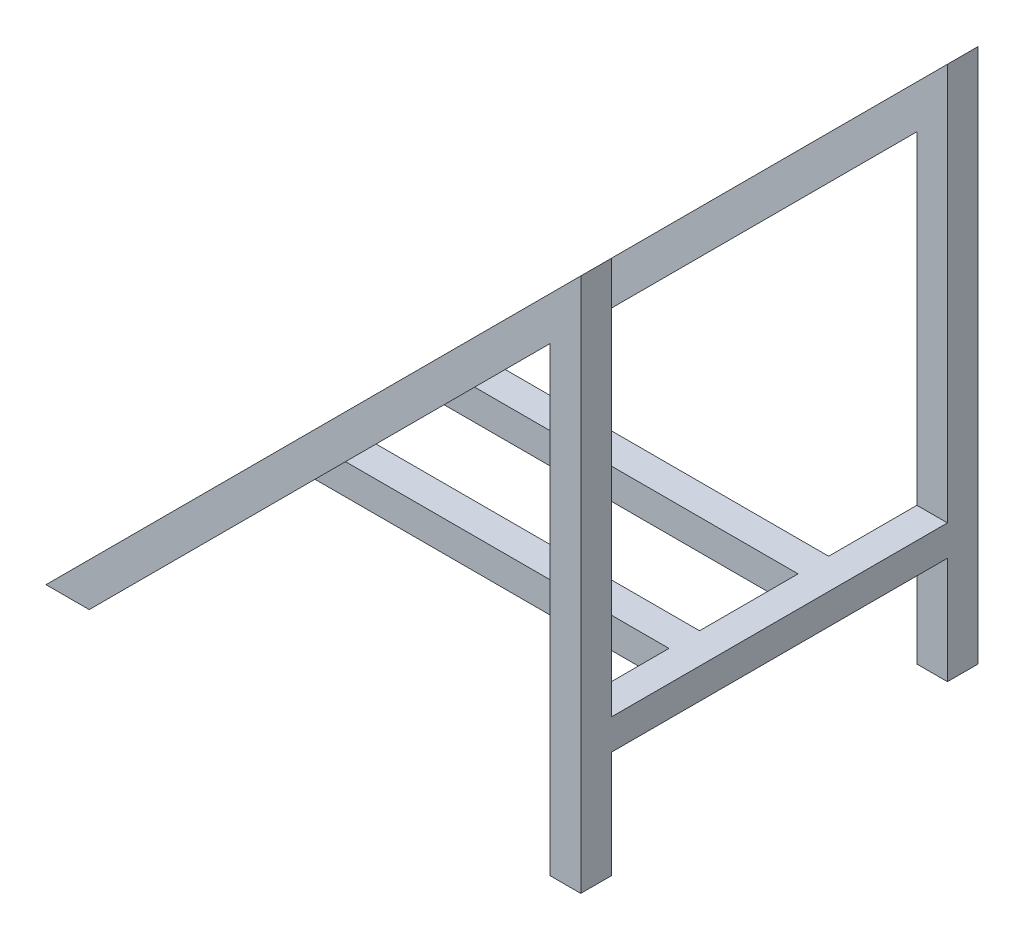
ISO-10303-21;
HEADER;
FILE_DESCRIPTION(('STEP AP214'),'2;1');
FILE_NAME('part.step','',(''),(''),'','','');
FILE_SCHEMA(('AUTOMOTIVE_DESIGN { 1 0 10303 214 1 1 1 1 }'));
ENDSEC;
DATA;
#1=APPLICATION_CONTEXT('core data for automotive mechanical design processes');
#2=APPLICATION_PROTOCOL_DEFINITION('international standard','automotive_design',2000,#1);
#3=PRODUCT_CONTEXT('',#1,'mechanical');
#4=PRODUCT('Part','Part','',(#3));
#5=PRODUCT_RELATED_PRODUCT_CATEGORY('part','',(#4));
#6=PRODUCT_DEFINITION_FORMATION('','',#4);
#7=PRODUCT_DEFINITION_CONTEXT('part definition',#1,'design');
#8=PRODUCT_DEFINITION('design','',#6,#7);
#9=PRODUCT_DEFINITION_SHAPE('','',#8);
#10=(LENGTH_UNIT() NAMED_UNIT(*) SI_UNIT(.MILLI.,.METRE.));
#11=(NAMED_UNIT(*) PLANE_ANGLE_UNIT() SI_UNIT($,.RADIAN.));
#12=(NAMED_UNIT(*) SI_UNIT($,.STERADIAN.) SOLID_ANGLE_UNIT());
#13=UNCERTAINTY_MEASURE_WITH_UNIT(LENGTH_MEASURE(1.E-05),#10,'distance_accuracy_value','');
#14=(GEOMETRIC_REPRESENTATION_CONTEXT(3) GLOBAL_UNCERTAINTY_ASSIGNED_CONTEXT((#13)) GLOBAL_UNIT_ASSIGNED_CONTEXT((#10,
#11,#12)) REPRESENTATION_CONTEXT('',''));
#15=CARTESIAN_POINT('',(0.,0.,0.));
#16=DIRECTION('',(0.,0.,1.));
#17=DIRECTION('',(1.,0.,0.));
#18=AXIS2_PLACEMENT_3D('',#15,#16,#17);
#19=CARTESIAN_POINT('',(28.2842712474618,0.,20.));
#20=DIRECTION('',(-0.707106781186549,0.707106781186546,0.));
#21=DIRECTION('',(-0.707106781186546,-0.707106781186549,0.));
#22=AXIS2_PLACEMENT_3D('',#19,#20,#21);
#23=PLANE('',#22);
#24=DIRECTION('',(-0.707106781186546,-0.707106781186549,0.));
#25=VECTOR('',#24,1.);
#26=CARTESIAN_POINT('',(98.2842712474616,70.,77.75));
#27=LINE('',#26,#25);
#28=CARTESIAN_POINT('',(112.426406871193,84.142135623731,77.75));
#29=VERTEX_POINT('',#28);
#30=CARTESIAN_POINT('',(98.2842712474616,70.,77.75));
#31=VERTEX_POINT('',#30);
#32=EDGE_CURVE('E253',#29,#31,#27,.T.);
#33=ORIENTED_EDGE('',*,*,#32,.T.);
#34=DIRECTION('',(0.,0.,-1.));
#35=VECTOR('',#34,1.);
#36=CARTESIAN_POINT('',(98.2842712474619,70.,240.));
#37=LINE('',#36,#35);
#38=CARTESIAN_POINT('',(98.2842712474619,70.,20.));
#39=VERTEX_POINT('',#38);
#40=EDGE_CURVE('E377',#31,#39,#37,.T.);
#41=ORIENTED_EDGE('',*,*,#40,.T.);
#42=DIRECTION('',(0.707106781186546,0.707106781186549,0.));
#43=VECTOR('',#42,1.);
#44=CARTESIAN_POINT('',(28.2842712474618,0.,20.));
#45=LINE('',#44,#43);
#46=CARTESIAN_POINT('',(28.2842712474618,0.,20.));
#47=VERTEX_POINT('',#46);
#48=EDGE_CURVE('E407',#47,#39,#45,.T.);
#49=ORIENTED_EDGE('',*,*,#48,.F.);
#50=DIRECTION('',(0.,0.,-1.));
#51=VECTOR('',#50,1.);
#52=CARTESIAN_POINT('',(28.2842712474618,0.,20.));
#53=LINE('',#52,#51);
#54=CARTESIAN_POINT('',(28.2842712474618,0.,0.));
#55=VERTEX_POINT('',#54);
#56=EDGE_CURVE('E11',#47,#55,#53,.T.);
#57=ORIENTED_EDGE('',*,*,#56,.T.);
#58=DIRECTION('',(0.707106781186546,0.707106781186549,0.));
#59=VECTOR('',#58,1.);
#60=CARTESIAN_POINT('',(28.2842712474618,0.,0.));
#61=LINE('',#60,#59);
#62=CARTESIAN_POINT('',(329.999999999999,301.715728752538,0.));
#63=VERTEX_POINT('',#62);
#64=EDGE_CURVE('E427',#55,#63,#61,.T.);
#65=ORIENTED_EDGE('',*,*,#64,.T.);
#66=DIRECTION('',(0.,0.,-1.));
#67=VECTOR('',#66,1.);
#68=CARTESIAN_POINT('',(329.999999999999,301.715728752538,20.));
#69=LINE('',#68,#67);
#70=CARTESIAN_POINT('',(329.999999999999,301.715728752538,20.));
#71=VERTEX_POINT('',#70);
#72=EDGE_CURVE('E40',#71,#63,#69,.T.);
#73=ORIENTED_EDGE('',*,*,#72,.F.);
#74=CARTESIAN_POINT('',(112.426406871193,84.142135623731,20.));
#75=VERTEX_POINT('',#74);
#76=EDGE_CURVE('E405',#75,#71,#45,.T.);
#77=ORIENTED_EDGE('',*,*,#76,.F.);
#78=DIRECTION('',(0.,0.,-1.));
#79=VECTOR('',#78,1.);
#80=CARTESIAN_POINT('',(112.426406871193,84.142135623731,240.));
#81=LINE('',#80,#79);
#82=EDGE_CURVE('E373',#29,#75,#81,.T.);
#83=ORIENTED_EDGE('',*,*,#82,.F.);
#84=EDGE_LOOP('',(#33,#41,#49,#57,#65,#73,#77,#83));
#85=FACE_BOUND('',#84,.T.);
#86=ADVANCED_FACE('F32',(#85),#23,.F.);
#87=CARTESIAN_POINT('',(329.999999999999,301.715728752538,20.));
#88=DIRECTION('',(1.,0.,0.));
#89=DIRECTION('',(0.,1.,0.));
#90=AXIS2_PLACEMENT_3D('',#87,#88,#89);
#91=PLANE('',#90);
#92=DIRECTION('',(0.,1.,0.));
#93=VECTOR('',#92,1.);
#94=CARTESIAN_POINT('',(329.999999999999,70.,77.75));
#95=LINE('',#94,#93);
#96=CARTESIAN_POINT('',(329.999999999999,70.,77.75));
#97=VERTEX_POINT('',#96);
#98=CARTESIAN_POINT('',(329.999999999999,90.,77.75));
#99=VERTEX_POINT('',#98);
#100=EDGE_CURVE('E242',#97,#99,#95,.T.);
#101=ORIENTED_EDGE('',*,*,#100,.T.);
#102=DIRECTION('',(0.,0.,-1.));
#103=VECTOR('',#102,1.);
#104=CARTESIAN_POINT('',(329.999999999999,90.,240.));
#105=LINE('',#104,#103);
#106=CARTESIAN_POINT('',(329.999999999999,90.,20.));
#107=VERTEX_POINT('',#106);
#108=EDGE_CURVE('E230',#99,#107,#105,.T.);
#109=ORIENTED_EDGE('',*,*,#108,.T.);
#110=DIRECTION('',(0.,-1.,0.));
#111=VECTOR('',#110,1.);
#112=CARTESIAN_POINT('',(329.999999999999,301.715728752538,20.));
#113=LINE('',#112,#111);
#114=EDGE_CURVE('E411',#71,#107,#113,.T.);
#115=ORIENTED_EDGE('',*,*,#114,.F.);
#116=ORIENTED_EDGE('',*,*,#72,.T.);
#117=DIRECTION('',(0.,-1.,0.));
#118=VECTOR('',#117,1.);
#119=CARTESIAN_POINT('',(329.999999999999,301.715728752538,0.));
#120=LINE('',#119,#118);
#121=CARTESIAN_POINT('',(329.999999999999,0.,0.));
#122=VERTEX_POINT('',#121);
#123=EDGE_CURVE('E429',#63,#122,#120,.T.);
#124=ORIENTED_EDGE('',*,*,#123,.T.);
#125=DIRECTION('',(0.,0.,-1.));
#126=VECTOR('',#125,1.);
#127=CARTESIAN_POINT('',(329.999999999999,0.,20.));
#128=LINE('',#127,#126);
#129=CARTESIAN_POINT('',(329.999999999999,0.,20.));
#130=VERTEX_POINT('',#129);
#131=EDGE_CURVE('E444',#130,#122,#128,.T.);
#132=ORIENTED_EDGE('',*,*,#131,.F.);
#133=CARTESIAN_POINT('',(329.999999999999,70.0000000000001,20.));
#134=VERTEX_POINT('',#133);
#135=EDGE_CURVE('E410',#134,#130,#113,.T.);
#136=ORIENTED_EDGE('',*,*,#135,.F.);
#137=DIRECTION('',(0.,0.,-1.));
#138=VECTOR('',#137,1.);
#139=CARTESIAN_POINT('',(329.999999999999,70.,240.));
#140=LINE('',#139,#138);
#141=EDGE_CURVE('E47',#97,#134,#140,.T.);
#142=ORIENTED_EDGE('',*,*,#141,.F.);
#143=EDGE_LOOP('',(#101,#109,#115,#116,#124,#132,#136,#142));
#144=FACE_BOUND('',#143,.T.);
#145=ADVANCED_FACE('F243',(#144),#91,.F.);
#146=CARTESIAN_POINT('',(98.2842712474616,70.,162.25));
#147=VERTEX_POINT('',#146);
#148=CARTESIAN_POINT('',(98.2842712474616,70.,97.75));
#149=VERTEX_POINT('',#148);
#150=EDGE_CURVE('E383',#147,#149,#37,.T.);
#151=ORIENTED_EDGE('',*,*,#150,.T.);
#152=DIRECTION('',(-0.707106781186546,-0.707106781186549,0.));
#153=VECTOR('',#152,1.);
#154=CARTESIAN_POINT('',(98.2842712474616,70.,97.75));
#155=LINE('',#154,#153);
#156=CARTESIAN_POINT('',(112.426406871193,84.1421356237311,97.75));
#157=VERTEX_POINT('',#156);
#158=EDGE_CURVE('E265',#157,#149,#155,.T.);
#159=ORIENTED_EDGE('',*,*,#158,.F.);
#160=CARTESIAN_POINT('',(112.426406871193,84.142135623731,162.25));
#161=VERTEX_POINT('',#160);
#162=EDGE_CURVE('E516',#161,#157,#81,.T.);
#163=ORIENTED_EDGE('',*,*,#162,.F.);
#164=DIRECTION('',(-0.707106781186546,-0.707106781186549,0.));
#165=VECTOR('',#164,1.);
#166=CARTESIAN_POINT('',(98.2842712474616,70.,162.25));
#167=LINE('',#166,#165);
#168=EDGE_CURVE('E283',#161,#147,#167,.T.);
#169=ORIENTED_EDGE('',*,*,#168,.T.);
#170=EDGE_LOOP('',(#151,#159,#163,#169));
#171=FACE_BOUND('',#170,.T.);
#172=ADVANCED_FACE('F512',(#171),#23,.F.);
#173=CARTESIAN_POINT('',(329.999999999999,90.,162.25));
#174=VERTEX_POINT('',#173);
#175=CARTESIAN_POINT('',(329.999999999999,90.,97.75));
#176=VERTEX_POINT('',#175);
#177=EDGE_CURVE('E238',#174,#176,#105,.T.);
#178=ORIENTED_EDGE('',*,*,#177,.T.);
#179=DIRECTION('',(0.,1.,0.));
#180=VECTOR('',#179,1.);
#181=CARTESIAN_POINT('',(329.999999999999,70.,97.75));
#182=LINE('',#181,#180);
#183=CARTESIAN_POINT('',(329.999999999999,70.,97.75));
#184=VERTEX_POINT('',#183);
#185=EDGE_CURVE('E55',#184,#176,#182,.T.);
#186=ORIENTED_EDGE('',*,*,#185,.F.);
#187=CARTESIAN_POINT('',(329.999999999999,70.,162.25));
#188=VERTEX_POINT('',#187);
#189=EDGE_CURVE('E401',#188,#184,#140,.T.);
#190=ORIENTED_EDGE('',*,*,#189,.F.);
#191=DIRECTION('',(0.,1.,0.));
#192=VECTOR('',#191,1.);
#193=CARTESIAN_POINT('',(329.999999999999,70.,162.25));
#194=LINE('',#193,#192);
#195=EDGE_CURVE('E276',#188,#174,#194,.T.);
#196=ORIENTED_EDGE('',*,*,#195,.T.);
#197=EDGE_LOOP('',(#178,#186,#190,#196));
#198=FACE_BOUND('',#197,.T.);
#199=ADVANCED_FACE('F562',(#198),#91,.F.);
#200=CARTESIAN_POINT('',(0.,0.,20.));
#201=DIRECTION('',(0.,0.,-1.));
#202=DIRECTION('',(-1.,0.,0.));
#203=AXIS2_PLACEMENT_3D('',#200,#201,#202);
#204=PLANE('',#203);
#205=DIRECTION('',(0.707106781186548,-0.707106781186547,0.));
#206=VECTOR('',#205,1.);
#207=CARTESIAN_POINT('',(98.2842712474619,70.,20.));
#208=LINE('',#207,#206);
#209=CARTESIAN_POINT('',(84.1421356237309,84.1421356237309,20.));
#210=VERTEX_POINT('',#209);
#211=EDGE_CURVE('E357',#210,#39,#208,.T.);
#212=ORIENTED_EDGE('',*,*,#211,.F.);
#213=DIRECTION('',(0.707106781186546,0.707106781186549,0.));
#214=VECTOR('',#213,1.);
#215=CARTESIAN_POINT('',(0.,0.,20.));
#216=LINE('',#215,#214);
#217=CARTESIAN_POINT('',(0.,0.,20.));
#218=VERTEX_POINT('',#217);
#219=EDGE_CURVE('E421',#218,#210,#216,.T.);
#220=ORIENTED_EDGE('',*,*,#219,.F.);
#221=DIRECTION('',(1.,0.,0.));
#222=VECTOR('',#221,1.);
#223=CARTESIAN_POINT('',(0.,0.,20.));
#224=LINE('',#223,#222);
#225=EDGE_CURVE('E402',#218,#47,#224,.T.);
#226=ORIENTED_EDGE('',*,*,#225,.T.);
#227=ORIENTED_EDGE('',*,*,#48,.T.);
#228=EDGE_LOOP('',(#212,#220,#226,#227));
#229=FACE_BOUND('',#228,.T.);
#230=ADVANCED_FACE('F502',(#229),#204,.F.);
#231=DIRECTION('',(-0.707106781186547,0.707106781186547,0.));
#232=VECTOR('',#231,1.);
#233=CARTESIAN_POINT('',(112.426406871193,84.142135623731,20.));
#234=LINE('',#233,#232);
#235=CARTESIAN_POINT('',(98.2842712474615,98.2842712474619,20.));
#236=VERTEX_POINT('',#235);
#237=EDGE_CURVE('E362',#75,#236,#234,.T.);
#238=ORIENTED_EDGE('',*,*,#237,.F.);
#239=ORIENTED_EDGE('',*,*,#76,.T.);
#240=ORIENTED_EDGE('',*,*,#114,.T.);
#241=DIRECTION('',(-1.,0.,0.));
#242=VECTOR('',#241,1.);
#243=CARTESIAN_POINT('',(329.999999999999,90.,20.));
#244=LINE('',#243,#242);
#245=CARTESIAN_POINT('',(349.999999999999,90.,20.));
#246=VERTEX_POINT('',#245);
#247=EDGE_CURVE('E235',#246,#107,#244,.T.);
#248=ORIENTED_EDGE('',*,*,#247,.F.);
#249=DIRECTION('',(0.,-1.,0.));
#250=VECTOR('',#249,1.);
#251=CARTESIAN_POINT('',(349.999999999999,350.,20.));
#252=LINE('',#251,#250);
#253=CARTESIAN_POINT('',(349.999999999999,350.,20.));
#254=VERTEX_POINT('',#253);
#255=EDGE_CURVE('E417',#254,#246,#252,.T.);
#256=ORIENTED_EDGE('',*,*,#255,.F.);
#257=EDGE_CURVE('E420',#236,#254,#216,.T.);
#258=ORIENTED_EDGE('',*,*,#257,.F.);
#259=EDGE_LOOP('',(#238,#239,#240,#248,#256,#258));
#260=FACE_BOUND('',#259,.T.);
#261=ADVANCED_FACE('F537',(#260),#204,.F.);
#262=DIRECTION('',(1.,0.,0.));
#263=VECTOR('',#262,1.);
#264=CARTESIAN_POINT('',(329.999999999999,70.,20.));
#265=LINE('',#264,#263);
#266=CARTESIAN_POINT('',(349.999999999999,70.,20.));
#267=VERTEX_POINT('',#266);
#268=EDGE_CURVE('E382',#134,#267,#265,.T.);
#269=ORIENTED_EDGE('',*,*,#268,.F.);
#270=ORIENTED_EDGE('',*,*,#135,.T.);
#271=DIRECTION('',(1.,0.,0.));
#272=VECTOR('',#271,1.);
#273=CARTESIAN_POINT('',(329.999999999999,0.,20.));
#274=LINE('',#273,#272);
#275=CARTESIAN_POINT('',(349.999999999999,0.,20.));
#276=VERTEX_POINT('',#275);
#277=EDGE_CURVE('E413',#130,#276,#274,.T.);
#278=ORIENTED_EDGE('',*,*,#277,.T.);
#279=EDGE_CURVE('E416',#267,#276,#252,.T.);
#280=ORIENTED_EDGE('',*,*,#279,.F.);
#281=EDGE_LOOP('',(#269,#270,#278,#280));
#282=FACE_BOUND('',#281,.T.);
#283=ADVANCED_FACE('F463',(#282),#204,.F.);
#284=CARTESIAN_POINT('',(0.,0.,20.));
#285=DIRECTION('',(0.,1.,0.));
#286=DIRECTION('',(0.,0.,1.));
#287=AXIS2_PLACEMENT_3D('',#284,#285,#286);
#288=PLANE('',#287);
#289=DIRECTION('',(1.,0.,0.));
#290=VECTOR('',#289,1.);
#291=CARTESIAN_POINT('',(0.,0.,0.));
#292=LINE('',#291,#290);
#293=CARTESIAN_POINT('',(0.,0.,0.));
#294=VERTEX_POINT('',#293);
#295=EDGE_CURVE('E400',#294,#55,#292,.T.);
#296=ORIENTED_EDGE('',*,*,#295,.T.);
#297=ORIENTED_EDGE('',*,*,#56,.F.);
#298=ORIENTED_EDGE('',*,*,#225,.F.);
#299=DIRECTION('',(0.,0.,-1.));
#300=VECTOR('',#299,1.);
#301=CARTESIAN_POINT('',(0.,0.,20.));
#302=LINE('',#301,#300);
#303=EDGE_CURVE('E424',#218,#294,#302,.T.);
#304=ORIENTED_EDGE('',*,*,#303,.T.);
#305=EDGE_LOOP('',(#296,#297,#298,#304));
#306=FACE_BOUND('',#305,.T.);
#307=ADVANCED_FACE('F34',(#306),#288,.F.);
#308=CARTESIAN_POINT('',(98.2842712474619,70.,240.));
#309=VERTEX_POINT('',#308);
#310=CARTESIAN_POINT('',(98.2842712474616,70.,182.25));
#311=VERTEX_POINT('',#310);
#312=EDGE_CURVE('E379',#309,#311,#37,.T.);
#313=ORIENTED_EDGE('',*,*,#312,.T.);
#314=DIRECTION('',(-0.707106781186546,-0.707106781186549,0.));
#315=VECTOR('',#314,1.);
#316=CARTESIAN_POINT('',(98.2842712474616,70.,182.25));
#317=LINE('',#316,#315);
#318=CARTESIAN_POINT('',(112.426406871193,84.1421356237311,182.25));
#319=VERTEX_POINT('',#318);
#320=EDGE_CURVE('E295',#319,#311,#317,.T.);
#321=ORIENTED_EDGE('',*,*,#320,.F.);
#322=CARTESIAN_POINT('',(112.426406871193,84.142135623731,240.));
#323=VERTEX_POINT('',#322);
#324=EDGE_CURVE('E374',#323,#319,#81,.T.);
#325=ORIENTED_EDGE('',*,*,#324,.F.);
#326=DIRECTION('',(0.707106781186546,0.707106781186549,0.));
#327=VECTOR('',#326,1.);
#328=CARTESIAN_POINT('',(28.2842712474618,0.,240.));
#329=LINE('',#328,#327);
#330=CARTESIAN_POINT('',(329.999999999999,301.715728752538,240.));
#331=VERTEX_POINT('',#330);
#332=EDGE_CURVE('E325',#323,#331,#329,.T.);
#333=ORIENTED_EDGE('',*,*,#332,.T.);
#334=DIRECTION('',(0.,0.,1.));
#335=VECTOR('',#334,1.);
#336=CARTESIAN_POINT('',(329.999999999999,301.715728752538,240.));
#337=LINE('',#336,#335);
#338=CARTESIAN_POINT('',(329.999999999999,301.715728752538,260.));
#339=VERTEX_POINT('',#338);
#340=EDGE_CURVE('E346',#331,#339,#337,.T.);
#341=ORIENTED_EDGE('',*,*,#340,.T.);
#342=DIRECTION('',(0.707106781186546,0.707106781186549,0.));
#343=VECTOR('',#342,1.);
#344=CARTESIAN_POINT('',(28.2842712474618,0.,260.));
#345=LINE('',#344,#343);
#346=CARTESIAN_POINT('',(28.2842712474618,0.,260.));
#347=VERTEX_POINT('',#346);
#348=EDGE_CURVE('E310',#347,#339,#345,.T.);
#349=ORIENTED_EDGE('',*,*,#348,.F.);
#350=DIRECTION('',(0.,0.,1.));
#351=VECTOR('',#350,1.);
#352=CARTESIAN_POINT('',(28.2842712474618,0.,240.));
#353=LINE('',#352,#351);
#354=CARTESIAN_POINT('',(28.2842712474618,0.,240.));
#355=VERTEX_POINT('',#354);
#356=EDGE_CURVE('E329',#355,#347,#353,.T.);
#357=ORIENTED_EDGE('',*,*,#356,.F.);
#358=EDGE_CURVE('E326',#355,#309,#329,.T.);
#359=ORIENTED_EDGE('',*,*,#358,.T.);
#360=EDGE_LOOP('',(#313,#321,#325,#333,#341,#349,#357,#359));
#361=FACE_BOUND('',#360,.T.);
#362=ADVANCED_FACE('F490',(#361),#23,.F.);
#363=CARTESIAN_POINT('',(329.999999999999,90.,240.));
#364=VERTEX_POINT('',#363);
#365=CARTESIAN_POINT('',(329.999999999999,90.,182.25));
#366=VERTEX_POINT('',#365);
#367=EDGE_CURVE('E241',#364,#366,#105,.T.);
#368=ORIENTED_EDGE('',*,*,#367,.T.);
#369=DIRECTION('',(0.,1.,0.));
#370=VECTOR('',#369,1.);
#371=CARTESIAN_POINT('',(329.999999999999,70.,182.25));
#372=LINE('',#371,#370);
#373=CARTESIAN_POINT('',(329.999999999999,70.,182.25));
#374=VERTEX_POINT('',#373);
#375=EDGE_CURVE('E274',#374,#366,#372,.T.);
#376=ORIENTED_EDGE('',*,*,#375,.F.);
#377=CARTESIAN_POINT('',(329.999999999999,70.,240.));
#378=VERTEX_POINT('',#377);
#379=EDGE_CURVE('E397',#378,#374,#140,.T.);
#380=ORIENTED_EDGE('',*,*,#379,.F.);
#381=DIRECTION('',(0.,-1.,0.));
#382=VECTOR('',#381,1.);
#383=CARTESIAN_POINT('',(329.999999999999,301.715728752538,240.));
#384=LINE('',#383,#382);
#385=CARTESIAN_POINT('',(329.999999999999,0.,240.));
#386=VERTEX_POINT('',#385);
#387=EDGE_CURVE('E321',#378,#386,#384,.T.);
#388=ORIENTED_EDGE('',*,*,#387,.T.);
#389=DIRECTION('',(0.,0.,1.));
#390=VECTOR('',#389,1.);
#391=CARTESIAN_POINT('',(329.999999999999,0.,240.));
#392=LINE('',#391,#390);
#393=CARTESIAN_POINT('',(329.999999999999,0.,260.));
#394=VERTEX_POINT('',#393);
#395=EDGE_CURVE('E348',#386,#394,#392,.T.);
#396=ORIENTED_EDGE('',*,*,#395,.T.);
#397=DIRECTION('',(0.,-1.,0.));
#398=VECTOR('',#397,1.);
#399=CARTESIAN_POINT('',(329.999999999999,301.715728752538,260.));
#400=LINE('',#399,#398);
#401=EDGE_CURVE('E340',#339,#394,#400,.T.);
#402=ORIENTED_EDGE('',*,*,#401,.F.);
#403=ORIENTED_EDGE('',*,*,#340,.F.);
#404=EDGE_CURVE('E322',#331,#364,#384,.T.);
#405=ORIENTED_EDGE('',*,*,#404,.T.);
#406=EDGE_LOOP('',(#368,#376,#380,#388,#396,#402,#403,#405));
#407=FACE_BOUND('',#406,.T.);
#408=ADVANCED_FACE('F477',(#407),#91,.F.);
#409=CARTESIAN_POINT('',(329.999999999999,0.,20.));
#410=DIRECTION('',(0.,1.,0.));
#411=DIRECTION('',(0.,0.,1.));
#412=AXIS2_PLACEMENT_3D('',#409,#410,#411);
#413=PLANE('',#412);
#414=DIRECTION('',(1.,0.,0.));
#415=VECTOR('',#414,1.);
#416=CARTESIAN_POINT('',(329.999999999999,0.,0.));
#417=LINE('',#416,#415);
#418=CARTESIAN_POINT('',(349.999999999999,0.,0.));
#419=VERTEX_POINT('',#418);
#420=EDGE_CURVE('E431',#122,#419,#417,.T.);
#421=ORIENTED_EDGE('',*,*,#420,.T.);
#422=DIRECTION('',(0.,0.,-1.));
#423=VECTOR('',#422,1.);
#424=CARTESIAN_POINT('',(349.999999999999,0.,20.));
#425=LINE('',#424,#423);
#426=EDGE_CURVE('E442',#276,#419,#425,.T.);
#427=ORIENTED_EDGE('',*,*,#426,.F.);
#428=ORIENTED_EDGE('',*,*,#277,.F.);
#429=ORIENTED_EDGE('',*,*,#131,.T.);
#430=EDGE_LOOP('',(#421,#427,#428,#429));
#431=FACE_BOUND('',#430,.T.);
#432=ADVANCED_FACE('F459',(#431),#413,.F.);
#433=CARTESIAN_POINT('',(349.999999999999,350.,20.));
#434=DIRECTION('',(1.,0.,0.));
#435=DIRECTION('',(0.,1.,0.));
#436=AXIS2_PLACEMENT_3D('',#433,#434,#435);
#437=PLANE('',#436);
#438=DIRECTION('',(0.,-1.,0.));
#439=VECTOR('',#438,1.);
#440=CARTESIAN_POINT('',(349.999999999999,350.,0.));
#441=LINE('',#440,#439);
#442=CARTESIAN_POINT('',(349.999999999999,350.,0.));
#443=VERTEX_POINT('',#442);
#444=EDGE_CURVE('E434',#443,#419,#441,.T.);
#445=ORIENTED_EDGE('',*,*,#444,.F.);
#446=DIRECTION('',(0.,0.,-1.));
#447=VECTOR('',#446,1.);
#448=CARTESIAN_POINT('',(349.999999999999,350.,20.));
#449=LINE('',#448,#447);
#450=EDGE_CURVE('E440',#254,#443,#449,.T.);
#451=ORIENTED_EDGE('',*,*,#450,.F.);
#452=ORIENTED_EDGE('',*,*,#255,.T.);
#453=DIRECTION('',(0.,0.,-1.));
#454=VECTOR('',#453,1.);
#455=CARTESIAN_POINT('',(349.999999999999,90.,240.));
#456=LINE('',#455,#454);
#457=CARTESIAN_POINT('',(349.999999999999,90.,240.));
#458=VERTEX_POINT('',#457);
#459=EDGE_CURVE('E392',#458,#246,#456,.T.);
#460=ORIENTED_EDGE('',*,*,#459,.F.);
#461=DIRECTION('',(0.,-1.,0.));
#462=VECTOR('',#461,1.);
#463=CARTESIAN_POINT('',(349.999999999999,350.,240.));
#464=LINE('',#463,#462);
#465=CARTESIAN_POINT('',(349.999999999999,350.,240.));
#466=VERTEX_POINT('',#465);
#467=EDGE_CURVE('E315',#466,#458,#464,.T.);
#468=ORIENTED_EDGE('',*,*,#467,.F.);
#469=DIRECTION('',(0.,0.,1.));
#470=VECTOR('',#469,1.);
#471=CARTESIAN_POINT('',(349.999999999999,350.,240.));
#472=LINE('',#471,#470);
#473=CARTESIAN_POINT('',(349.999999999999,350.,260.));
#474=VERTEX_POINT('',#473);
#475=EDGE_CURVE('E352',#466,#474,#472,.T.);
#476=ORIENTED_EDGE('',*,*,#475,.T.);
#477=DIRECTION('',(0.,-1.,0.));
#478=VECTOR('',#477,1.);
#479=CARTESIAN_POINT('',(349.999999999999,350.,260.));
#480=LINE('',#479,#478);
#481=CARTESIAN_POINT('',(349.999999999999,0.,260.));
#482=VERTEX_POINT('',#481);
#483=EDGE_CURVE('E334',#474,#482,#480,.T.);
#484=ORIENTED_EDGE('',*,*,#483,.T.);
#485=DIRECTION('',(0.,0.,1.));
#486=VECTOR('',#485,1.);
#487=CARTESIAN_POINT('',(349.999999999999,0.,240.));
#488=LINE('',#487,#486);
#489=CARTESIAN_POINT('',(349.999999999999,0.,240.));
#490=VERTEX_POINT('',#489);
#491=EDGE_CURVE('E350',#490,#482,#488,.T.);
#492=ORIENTED_EDGE('',*,*,#491,.F.);
#493=CARTESIAN_POINT('',(349.999999999999,70.,240.));
#494=VERTEX_POINT('',#493);
#495=EDGE_CURVE('E314',#494,#490,#464,.T.);
#496=ORIENTED_EDGE('',*,*,#495,.F.);
#497=DIRECTION('',(0.,0.,-1.));
#498=VECTOR('',#497,1.);
#499=CARTESIAN_POINT('',(349.999999999999,70.,240.));
#500=LINE('',#499,#498);
#501=EDGE_CURVE('E394',#494,#267,#500,.T.);
#502=ORIENTED_EDGE('',*,*,#501,.T.);
#503=ORIENTED_EDGE('',*,*,#279,.T.);
#504=ORIENTED_EDGE('',*,*,#426,.T.);
#505=EDGE_LOOP('',(#445,#451,#452,#460,#468,#476,#484,#492,#496,#502,#503,#504));
#506=FACE_BOUND('',#505,.T.);
#507=ADVANCED_FACE('F468',(#506),#437,.T.);
#508=CARTESIAN_POINT('',(0.,0.,20.));
#509=DIRECTION('',(-0.707106781186549,0.707106781186546,0.));
#510=DIRECTION('',(-0.707106781186546,-0.707106781186549,0.));
#511=AXIS2_PLACEMENT_3D('',#508,#509,#510);
#512=PLANE('',#511);
#513=DIRECTION('',(0.707106781186546,0.707106781186549,0.));
#514=VECTOR('',#513,1.);
#515=CARTESIAN_POINT('',(0.,0.,0.));
#516=LINE('',#515,#514);
#517=EDGE_CURVE('E406',#294,#443,#516,.T.);
#518=ORIENTED_EDGE('',*,*,#517,.F.);
#519=ORIENTED_EDGE('',*,*,#303,.F.);
#520=ORIENTED_EDGE('',*,*,#219,.T.);
#521=DIRECTION('',(0.,0.,-1.));
#522=VECTOR('',#521,1.);
#523=CARTESIAN_POINT('',(84.1421356237309,84.1421356237309,240.));
#524=LINE('',#523,#522);
#525=CARTESIAN_POINT('',(84.1421356237309,84.1421356237309,240.));
#526=VERTEX_POINT('',#525);
#527=EDGE_CURVE('E365',#526,#210,#524,.T.);
#528=ORIENTED_EDGE('',*,*,#527,.F.);
#529=DIRECTION('',(0.707106781186546,0.707106781186549,0.));
#530=VECTOR('',#529,1.);
#531=CARTESIAN_POINT('',(0.,0.,240.));
#532=LINE('',#531,#530);
#533=CARTESIAN_POINT('',(0.,0.,240.));
#534=VERTEX_POINT('',#533);
#535=EDGE_CURVE('E311',#534,#526,#532,.T.);
#536=ORIENTED_EDGE('',*,*,#535,.F.);
#537=DIRECTION('',(0.,0.,1.));
#538=VECTOR('',#537,1.);
#539=CARTESIAN_POINT('',(0.,0.,240.));
#540=LINE('',#539,#538);
#541=CARTESIAN_POINT('',(0.,0.,260.));
#542=VERTEX_POINT('',#541);
#543=EDGE_CURVE('E355',#534,#542,#540,.T.);
#544=ORIENTED_EDGE('',*,*,#543,.T.);
#545=DIRECTION('',(0.707106781186546,0.707106781186549,0.));
#546=VECTOR('',#545,1.);
#547=CARTESIAN_POINT('',(0.,0.,260.));
#548=LINE('',#547,#546);
#549=EDGE_CURVE('E332',#542,#474,#548,.T.);
#550=ORIENTED_EDGE('',*,*,#549,.T.);
#551=ORIENTED_EDGE('',*,*,#475,.F.);
#552=CARTESIAN_POINT('',(98.2842712474617,98.2842712474621,240.));
#553=VERTEX_POINT('',#552);
#554=EDGE_CURVE('E309',#553,#466,#532,.T.);
#555=ORIENTED_EDGE('',*,*,#554,.F.);
#556=DIRECTION('',(0.,0.,-1.));
#557=VECTOR('',#556,1.);
#558=CARTESIAN_POINT('',(98.2842712474619,98.2842712474619,240.));
#559=LINE('',#558,#557);
#560=EDGE_CURVE('E371',#553,#236,#559,.T.);
#561=ORIENTED_EDGE('',*,*,#560,.T.);
#562=ORIENTED_EDGE('',*,*,#257,.T.);
#563=ORIENTED_EDGE('',*,*,#450,.T.);
#564=EDGE_LOOP('',(#518,#519,#520,#528,#536,#544,#550,#551,#555,#561,#562,#563));
#565=FACE_BOUND('',#564,.T.);
#566=ADVANCED_FACE('F504',(#565),#512,.T.);
#567=CARTESIAN_POINT('',(0.,0.,0.));
#568=DIRECTION('',(0.,0.,-1.));
#569=DIRECTION('',(-1.,0.,0.));
#570=AXIS2_PLACEMENT_3D('',#567,#568,#569);
#571=PLANE('',#570);
#572=ORIENTED_EDGE('',*,*,#295,.F.);
#573=ORIENTED_EDGE('',*,*,#517,.T.);
#574=ORIENTED_EDGE('',*,*,#444,.T.);
#575=ORIENTED_EDGE('',*,*,#420,.F.);
#576=ORIENTED_EDGE('',*,*,#123,.F.);
#577=ORIENTED_EDGE('',*,*,#64,.F.);
#578=EDGE_LOOP('',(#572,#573,#574,#575,#576,#577));
#579=FACE_BOUND('',#578,.T.);
#580=ADVANCED_FACE('F455',(#579),#571,.T.);
#581=CARTESIAN_POINT('',(329.999999999999,70.,240.));
#582=DIRECTION('',(0.,1.,0.));
#583=DIRECTION('',(0.,0.,1.));
#584=AXIS2_PLACEMENT_3D('',#581,#582,#583);
#585=PLANE('',#584);
#586=ORIENTED_EDGE('',*,*,#268,.T.);
#587=ORIENTED_EDGE('',*,*,#501,.F.);
#588=DIRECTION('',(1.,0.,0.));
#589=VECTOR('',#588,1.);
#590=CARTESIAN_POINT('',(329.999999999999,70.,240.));
#591=LINE('',#590,#589);
#592=EDGE_CURVE('E384',#378,#494,#591,.T.);
#593=ORIENTED_EDGE('',*,*,#592,.F.);
#594=ORIENTED_EDGE('',*,*,#379,.T.);
#595=DIRECTION('',(1.,0.,0.));
#596=VECTOR('',#595,1.);
#597=CARTESIAN_POINT('',(329.999999999999,70.,182.25));
#598=LINE('',#597,#596);
#599=EDGE_CURVE('E280',#311,#374,#598,.T.);
#600=ORIENTED_EDGE('',*,*,#599,.F.);
#601=DIRECTION('',(0.,0.,1.));
#602=VECTOR('',#601,1.);
#603=CARTESIAN_POINT('',(98.2842712474616,70.,162.25));
#604=LINE('',#603,#602);
#605=EDGE_CURVE('E301',#147,#311,#604,.T.);
#606=ORIENTED_EDGE('',*,*,#605,.F.);
#607=DIRECTION('',(1.,0.,0.));
#608=VECTOR('',#607,1.);
#609=CARTESIAN_POINT('',(329.999999999999,70.,162.25));
#610=LINE('',#609,#608);
#611=EDGE_CURVE('E286',#147,#188,#610,.T.);
#612=ORIENTED_EDGE('',*,*,#611,.T.);
#613=ORIENTED_EDGE('',*,*,#189,.T.);
#614=DIRECTION('',(1.,0.,0.));
#615=VECTOR('',#614,1.);
#616=CARTESIAN_POINT('',(329.999999999999,70.,97.75));
#617=LINE('',#616,#615);
#618=EDGE_CURVE('E247',#149,#184,#617,.T.);
#619=ORIENTED_EDGE('',*,*,#618,.F.);
#620=DIRECTION('',(0.,0.,1.));
#621=VECTOR('',#620,1.);
#622=CARTESIAN_POINT('',(98.2842712474616,70.,77.75));
#623=LINE('',#622,#621);
#624=EDGE_CURVE('E271',#31,#149,#623,.T.);
#625=ORIENTED_EDGE('',*,*,#624,.F.);
#626=DIRECTION('',(1.,0.,0.));
#627=VECTOR('',#626,1.);
#628=CARTESIAN_POINT('',(329.999999999999,70.,77.75));
#629=LINE('',#628,#627);
#630=EDGE_CURVE('E258',#31,#97,#629,.T.);
#631=ORIENTED_EDGE('',*,*,#630,.T.);
#632=ORIENTED_EDGE('',*,*,#141,.T.);
#633=EDGE_LOOP('',(#586,#587,#593,#594,#600,#606,#612,#613,#619,#625,#631,#632));
#634=FACE_BOUND('',#633,.T.);
#635=ADVANCED_FACE('F465',(#634),#585,.F.);
#636=CARTESIAN_POINT('',(329.999999999999,90.,240.));
#637=DIRECTION('',(0.,-1.,0.));
#638=DIRECTION('',(1.,0.,0.));
#639=AXIS2_PLACEMENT_3D('',#636,#637,#638);
#640=PLANE('',#639);
#641=ORIENTED_EDGE('',*,*,#247,.T.);
#642=ORIENTED_EDGE('',*,*,#108,.F.);
#643=DIRECTION('',(-1.,0.,0.));
#644=VECTOR('',#643,1.);
#645=CARTESIAN_POINT('',(329.999999999999,90.,77.75));
#646=LINE('',#645,#644);
#647=CARTESIAN_POINT('',(118.284271247461,90.,77.75));
#648=VERTEX_POINT('',#647);
#649=EDGE_CURVE('E233',#99,#648,#646,.T.);
#650=ORIENTED_EDGE('',*,*,#649,.T.);
#651=DIRECTION('',(0.,0.,1.));
#652=VECTOR('',#651,1.);
#653=CARTESIAN_POINT('',(118.284271247461,90.,77.75));
#654=LINE('',#653,#652);
#655=CARTESIAN_POINT('',(118.284271247461,90.,97.75));
#656=VERTEX_POINT('',#655);
#657=EDGE_CURVE('E260',#648,#656,#654,.T.);
#658=ORIENTED_EDGE('',*,*,#657,.T.);
#659=DIRECTION('',(-1.,0.,0.));
#660=VECTOR('',#659,1.);
#661=CARTESIAN_POINT('',(329.999999999999,90.,97.75));
#662=LINE('',#661,#660);
#663=EDGE_CURVE('E262',#176,#656,#662,.T.);
#664=ORIENTED_EDGE('',*,*,#663,.F.);
#665=ORIENTED_EDGE('',*,*,#177,.F.);
#666=DIRECTION('',(-1.,0.,0.));
#667=VECTOR('',#666,1.);
#668=CARTESIAN_POINT('',(329.999999999999,90.,162.25));
#669=LINE('',#668,#667);
#670=CARTESIAN_POINT('',(118.284271247461,90.,162.25));
#671=VERTEX_POINT('',#670);
#672=EDGE_CURVE('E279',#174,#671,#669,.T.);
#673=ORIENTED_EDGE('',*,*,#672,.T.);
#674=DIRECTION('',(0.,0.,1.));
#675=VECTOR('',#674,1.);
#676=CARTESIAN_POINT('',(118.284271247461,90.,162.25));
#677=LINE('',#676,#675);
#678=CARTESIAN_POINT('',(118.284271247461,90.,182.25));
#679=VERTEX_POINT('',#678);
#680=EDGE_CURVE('E289',#671,#679,#677,.T.);
#681=ORIENTED_EDGE('',*,*,#680,.T.);
#682=DIRECTION('',(-1.,0.,0.));
#683=VECTOR('',#682,1.);
#684=CARTESIAN_POINT('',(329.999999999999,90.,182.25));
#685=LINE('',#684,#683);
#686=EDGE_CURVE('E292',#366,#679,#685,.T.);
#687=ORIENTED_EDGE('',*,*,#686,.F.);
#688=ORIENTED_EDGE('',*,*,#367,.F.);
#689=DIRECTION('',(-1.,0.,0.));
#690=VECTOR('',#689,1.);
#691=CARTESIAN_POINT('',(329.999999999999,90.,240.));
#692=LINE('',#691,#690);
#693=EDGE_CURVE('E239',#458,#364,#692,.T.);
#694=ORIENTED_EDGE('',*,*,#693,.F.);
#695=ORIENTED_EDGE('',*,*,#459,.T.);
#696=EDGE_LOOP('',(#641,#642,#650,#658,#664,#665,#673,#681,#687,#688,#694,#695));
#697=FACE_BOUND('',#696,.T.);
#698=ADVANCED_FACE('F231',(#697),#640,.F.);
#699=CARTESIAN_POINT('',(98.2842712474619,70.,240.));
#700=DIRECTION('',(0.707106781186547,0.707106781186548,0.));
#701=DIRECTION('',(-0.707106781186548,0.707106781186547,0.));
#702=AXIS2_PLACEMENT_3D('',#699,#700,#701);
#703=PLANE('',#702);
#704=ORIENTED_EDGE('',*,*,#211,.T.);
#705=ORIENTED_EDGE('',*,*,#40,.F.);
#706=ORIENTED_EDGE('',*,*,#624,.T.);
#707=ORIENTED_EDGE('',*,*,#150,.F.);
#708=ORIENTED_EDGE('',*,*,#605,.T.);
#709=ORIENTED_EDGE('',*,*,#312,.F.);
#710=DIRECTION('',(0.707106781186548,-0.707106781186547,0.));
#711=VECTOR('',#710,1.);
#712=CARTESIAN_POINT('',(98.2842712474619,70.,240.));
#713=LINE('',#712,#711);
#714=EDGE_CURVE('E358',#526,#309,#713,.T.);
#715=ORIENTED_EDGE('',*,*,#714,.F.);
#716=ORIENTED_EDGE('',*,*,#527,.T.);
#717=EDGE_LOOP('',(#704,#705,#706,#707,#708,#709,#715,#716));
#718=FACE_BOUND('',#717,.T.);
#719=ADVANCED_FACE('F486',(#718),#703,.F.);
#720=CARTESIAN_POINT('',(112.426406871193,84.142135623731,240.));
#721=DIRECTION('',(-0.707106781186547,-0.707106781186547,0.));
#722=DIRECTION('',(0.707106781186548,-0.707106781186548,0.));
#723=AXIS2_PLACEMENT_3D('',#720,#721,#722);
#724=PLANE('',#723);
#725=ORIENTED_EDGE('',*,*,#237,.T.);
#726=ORIENTED_EDGE('',*,*,#560,.F.);
#727=DIRECTION('',(-0.707106781186547,0.707106781186547,0.));
#728=VECTOR('',#727,1.);
#729=CARTESIAN_POINT('',(112.426406871193,84.142135623731,240.));
#730=LINE('',#729,#728);
#731=EDGE_CURVE('E361',#323,#553,#730,.T.);
#732=ORIENTED_EDGE('',*,*,#731,.F.);
#733=ORIENTED_EDGE('',*,*,#324,.T.);
#734=EDGE_CURVE('E378',#319,#161,#81,.T.);
#735=ORIENTED_EDGE('',*,*,#734,.T.);
#736=ORIENTED_EDGE('',*,*,#162,.T.);
#737=EDGE_CURVE('E531',#157,#29,#81,.T.);
#738=ORIENTED_EDGE('',*,*,#737,.T.);
#739=ORIENTED_EDGE('',*,*,#82,.T.);
#740=EDGE_LOOP('',(#725,#726,#732,#733,#735,#736,#738,#739));
#741=FACE_BOUND('',#740,.T.);
#742=ADVANCED_FACE('F534',(#741),#724,.F.);
#743=CARTESIAN_POINT('',(0.,0.,240.));
#744=DIRECTION('',(0.,0.,1.));
#745=DIRECTION('',(-1.,0.,0.));
#746=AXIS2_PLACEMENT_3D('',#743,#744,#745);
#747=PLANE('',#746);
#748=ORIENTED_EDGE('',*,*,#387,.F.);
#749=ORIENTED_EDGE('',*,*,#592,.T.);
#750=ORIENTED_EDGE('',*,*,#495,.T.);
#751=DIRECTION('',(1.,0.,0.));
#752=VECTOR('',#751,1.);
#753=CARTESIAN_POINT('',(329.999999999999,0.,240.));
#754=LINE('',#753,#752);
#755=EDGE_CURVE('E318',#386,#490,#754,.T.);
#756=ORIENTED_EDGE('',*,*,#755,.F.);
#757=EDGE_LOOP('',(#748,#749,#750,#756));
#758=FACE_BOUND('',#757,.T.);
#759=ADVANCED_FACE('F473',(#758),#747,.F.);
#760=ORIENTED_EDGE('',*,*,#467,.T.);
#761=ORIENTED_EDGE('',*,*,#693,.T.);
#762=ORIENTED_EDGE('',*,*,#404,.F.);
#763=ORIENTED_EDGE('',*,*,#332,.F.);
#764=ORIENTED_EDGE('',*,*,#731,.T.);
#765=ORIENTED_EDGE('',*,*,#554,.T.);
#766=EDGE_LOOP('',(#760,#761,#762,#763,#764,#765));
#767=FACE_BOUND('',#766,.T.);
#768=ADVANCED_FACE('F545',(#767),#747,.F.);
#769=ORIENTED_EDGE('',*,*,#535,.T.);
#770=ORIENTED_EDGE('',*,*,#714,.T.);
#771=ORIENTED_EDGE('',*,*,#358,.F.);
#772=DIRECTION('',(1.,0.,0.));
#773=VECTOR('',#772,1.);
#774=CARTESIAN_POINT('',(0.,0.,240.));
#775=LINE('',#774,#773);
#776=EDGE_CURVE('E306',#534,#355,#775,.T.);
#777=ORIENTED_EDGE('',*,*,#776,.F.);
#778=EDGE_LOOP('',(#769,#770,#771,#777));
#779=FACE_BOUND('',#778,.T.);
#780=ADVANCED_FACE('F495',(#779),#747,.F.);
#781=CARTESIAN_POINT('',(0.,0.,240.));
#782=DIRECTION('',(0.,-1.,0.));
#783=DIRECTION('',(0.,0.,-1.));
#784=AXIS2_PLACEMENT_3D('',#781,#782,#783);
#785=PLANE('',#784);
#786=DIRECTION('',(1.,0.,0.));
#787=VECTOR('',#786,1.);
#788=CARTESIAN_POINT('',(0.,0.,260.));
#789=LINE('',#788,#787);
#790=EDGE_CURVE('E304',#542,#347,#789,.T.);
#791=ORIENTED_EDGE('',*,*,#790,.F.);
#792=ORIENTED_EDGE('',*,*,#543,.F.);
#793=ORIENTED_EDGE('',*,*,#776,.T.);
#794=ORIENTED_EDGE('',*,*,#356,.T.);
#795=EDGE_LOOP('',(#791,#792,#793,#794));
#796=FACE_BOUND('',#795,.T.);
#797=ADVANCED_FACE('F652',(#796),#785,.T.);
#798=CARTESIAN_POINT('',(329.999999999999,0.,240.));
#799=DIRECTION('',(0.,-1.,0.));
#800=DIRECTION('',(0.,0.,-1.));
#801=AXIS2_PLACEMENT_3D('',#798,#799,#800);
#802=PLANE('',#801);
#803=DIRECTION('',(1.,0.,0.));
#804=VECTOR('',#803,1.);
#805=CARTESIAN_POINT('',(329.999999999999,0.,260.));
#806=LINE('',#805,#804);
#807=EDGE_CURVE('E337',#394,#482,#806,.T.);
#808=ORIENTED_EDGE('',*,*,#807,.F.);
#809=ORIENTED_EDGE('',*,*,#395,.F.);
#810=ORIENTED_EDGE('',*,*,#755,.T.);
#811=ORIENTED_EDGE('',*,*,#491,.T.);
#812=EDGE_LOOP('',(#808,#809,#810,#811));
#813=FACE_BOUND('',#812,.T.);
#814=ADVANCED_FACE('F555',(#813),#802,.T.);
#815=CARTESIAN_POINT('',(0.,0.,260.));
#816=DIRECTION('',(0.,0.,1.));
#817=DIRECTION('',(-1.,0.,0.));
#818=AXIS2_PLACEMENT_3D('',#815,#816,#817);
#819=PLANE('',#818);
#820=ORIENTED_EDGE('',*,*,#790,.T.);
#821=ORIENTED_EDGE('',*,*,#348,.T.);
#822=ORIENTED_EDGE('',*,*,#401,.T.);
#823=ORIENTED_EDGE('',*,*,#807,.T.);
#824=ORIENTED_EDGE('',*,*,#483,.F.);
#825=ORIENTED_EDGE('',*,*,#549,.F.);
#826=EDGE_LOOP('',(#820,#821,#822,#823,#824,#825));
#827=FACE_BOUND('',#826,.T.);
#828=ADVANCED_FACE('F550',(#827),#819,.T.);
#829=CARTESIAN_POINT('',(98.2842712474616,70.,162.25));
#830=DIRECTION('',(-0.707106781186549,0.707106781186546,0.));
#831=DIRECTION('',(-0.707106781186546,-0.707106781186549,0.));
#832=AXIS2_PLACEMENT_3D('',#829,#830,#831);
#833=PLANE('',#832);
#834=ORIENTED_EDGE('',*,*,#734,.F.);
#835=EDGE_CURVE('E296',#679,#319,#317,.T.);
#836=ORIENTED_EDGE('',*,*,#835,.F.);
#837=ORIENTED_EDGE('',*,*,#680,.F.);
#838=EDGE_CURVE('E284',#671,#161,#167,.T.);
#839=ORIENTED_EDGE('',*,*,#838,.T.);
#840=EDGE_LOOP('',(#834,#836,#837,#839));
#841=FACE_BOUND('',#840,.T.);
#842=ADVANCED_FACE('F561',(#841),#833,.T.);
#843=CARTESIAN_POINT('',(0.,0.,162.25));
#844=DIRECTION('',(0.,0.,1.));
#845=DIRECTION('',(1.,0.,0.));
#846=AXIS2_PLACEMENT_3D('',#843,#844,#845);
#847=PLANE('',#846);
#848=ORIENTED_EDGE('',*,*,#195,.F.);
#849=ORIENTED_EDGE('',*,*,#611,.F.);
#850=ORIENTED_EDGE('',*,*,#168,.F.);
#851=ORIENTED_EDGE('',*,*,#838,.F.);
#852=ORIENTED_EDGE('',*,*,#672,.F.);
#853=EDGE_LOOP('',(#848,#849,#850,#851,#852));
#854=FACE_BOUND('',#853,.T.);
#855=ADVANCED_FACE('F521',(#854),#847,.F.);
#856=CARTESIAN_POINT('',(0.,0.,182.25));
#857=DIRECTION('',(0.,0.,1.));
#858=DIRECTION('',(1.,0.,0.));
#859=AXIS2_PLACEMENT_3D('',#856,#857,#858);
#860=PLANE('',#859);
#861=ORIENTED_EDGE('',*,*,#375,.T.);
#862=ORIENTED_EDGE('',*,*,#686,.T.);
#863=ORIENTED_EDGE('',*,*,#835,.T.);
#864=ORIENTED_EDGE('',*,*,#320,.T.);
#865=ORIENTED_EDGE('',*,*,#599,.T.);
#866=EDGE_LOOP('',(#861,#862,#863,#864,#865));
#867=FACE_BOUND('',#866,.T.);
#868=ADVANCED_FACE('F481',(#867),#860,.T.);
#869=CARTESIAN_POINT('',(98.2842712474616,70.,77.75));
#870=DIRECTION('',(-0.707106781186549,0.707106781186546,0.));
#871=DIRECTION('',(-0.707106781186546,-0.707106781186549,0.));
#872=AXIS2_PLACEMENT_3D('',#869,#870,#871);
#873=PLANE('',#872);
#874=ORIENTED_EDGE('',*,*,#737,.F.);
#875=EDGE_CURVE('E266',#656,#157,#155,.T.);
#876=ORIENTED_EDGE('',*,*,#875,.F.);
#877=ORIENTED_EDGE('',*,*,#657,.F.);
#878=EDGE_CURVE('E252',#648,#29,#27,.T.);
#879=ORIENTED_EDGE('',*,*,#878,.T.);
#880=EDGE_LOOP('',(#874,#876,#877,#879));
#881=FACE_BOUND('',#880,.T.);
#882=ADVANCED_FACE('F529',(#881),#873,.T.);
#883=CARTESIAN_POINT('',(0.,0.,77.75));
#884=DIRECTION('',(0.,0.,1.));
#885=DIRECTION('',(1.,0.,0.));
#886=AXIS2_PLACEMENT_3D('',#883,#884,#885);
#887=PLANE('',#886);
#888=ORIENTED_EDGE('',*,*,#100,.F.);
#889=ORIENTED_EDGE('',*,*,#630,.F.);
#890=ORIENTED_EDGE('',*,*,#32,.F.);
#891=ORIENTED_EDGE('',*,*,#878,.F.);
#892=ORIENTED_EDGE('',*,*,#649,.F.);
#893=EDGE_LOOP('',(#888,#889,#890,#891,#892));
#894=FACE_BOUND('',#893,.T.);
#895=ADVANCED_FACE('F250',(#894),#887,.F.);
#896=CARTESIAN_POINT('',(0.,0.,97.75));
#897=DIRECTION('',(0.,0.,1.));
#898=DIRECTION('',(1.,0.,0.));
#899=AXIS2_PLACEMENT_3D('',#896,#897,#898);
#900=PLANE('',#899);
#901=ORIENTED_EDGE('',*,*,#185,.T.);
#902=ORIENTED_EDGE('',*,*,#663,.T.);
#903=ORIENTED_EDGE('',*,*,#875,.T.);
#904=ORIENTED_EDGE('',*,*,#158,.T.);
#905=ORIENTED_EDGE('',*,*,#618,.T.);
#906=EDGE_LOOP('',(#901,#902,#903,#904,#905));
#907=FACE_BOUND('',#906,.T.);
#908=ADVANCED_FACE('F525',(#907),#900,.T.);
#909=CLOSED_SHELL('',(#86,#145,#172,#199,#230,#261,#283,#307,#362,#408,#432,#507,#566,#580,#635,
#698,#719,#742,#759,#768,#780,#797,#814,#828,#842,#855,#868,#882,#895,#908));
#910=MANIFOLD_SOLID_BREP('B2',#909);
#911=ADVANCED_BREP_SHAPE_REPRESENTATION('',(#18,#910),#14);
#912=SHAPE_DEFINITION_REPRESENTATION(#9,#911);
ENDSEC;
END-ISO-10303-21;
